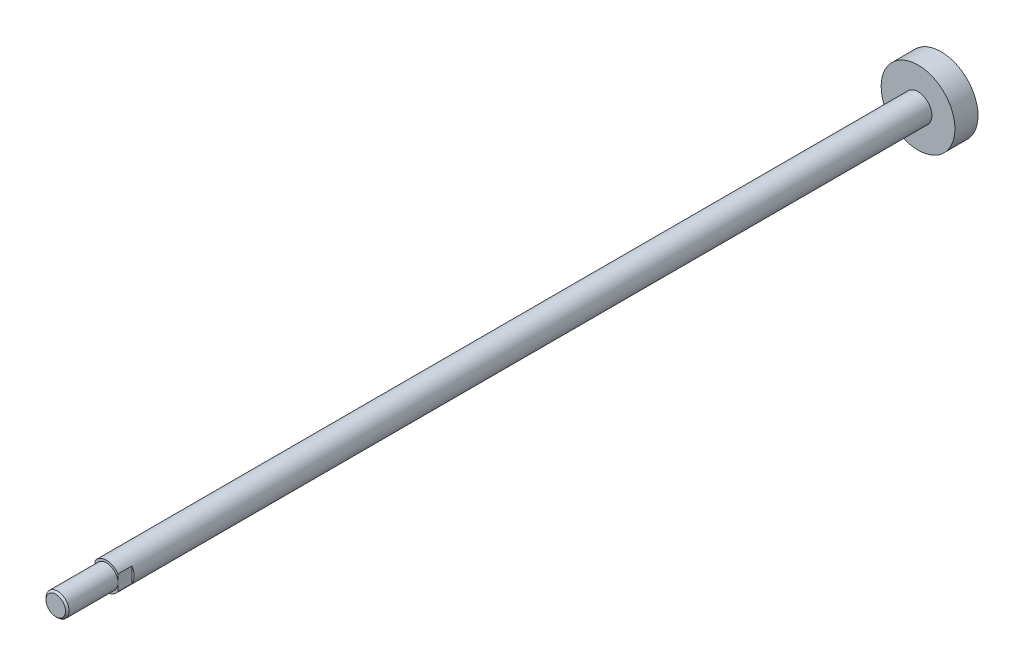
ISO-10303-21;
HEADER;
FILE_DESCRIPTION(('STEP AP214'),'2;1');
FILE_NAME('part.step','',(''),(''),'','','');
FILE_SCHEMA(('AUTOMOTIVE_DESIGN { 1 0 10303 214 1 1 1 1 }'));
ENDSEC;
DATA;
#1=APPLICATION_CONTEXT('core data for automotive mechanical design processes');
#2=APPLICATION_PROTOCOL_DEFINITION('international standard','automotive_design',2000,#1);
#3=PRODUCT_CONTEXT('',#1,'mechanical');
#4=PRODUCT('Part','Part','',(#3));
#5=PRODUCT_RELATED_PRODUCT_CATEGORY('part','',(#4));
#6=PRODUCT_DEFINITION_FORMATION('','',#4);
#7=PRODUCT_DEFINITION_CONTEXT('part definition',#1,'design');
#8=PRODUCT_DEFINITION('design','',#6,#7);
#9=PRODUCT_DEFINITION_SHAPE('','',#8);
#10=(LENGTH_UNIT() NAMED_UNIT(*) SI_UNIT(.MILLI.,.METRE.));
#11=(NAMED_UNIT(*) PLANE_ANGLE_UNIT() SI_UNIT($,.RADIAN.));
#12=(NAMED_UNIT(*) SI_UNIT($,.STERADIAN.) SOLID_ANGLE_UNIT());
#13=UNCERTAINTY_MEASURE_WITH_UNIT(LENGTH_MEASURE(1.E-05),#10,'distance_accuracy_value','');
#14=(GEOMETRIC_REPRESENTATION_CONTEXT(3) GLOBAL_UNCERTAINTY_ASSIGNED_CONTEXT((#13)) GLOBAL_UNIT_ASSIGNED_CONTEXT((#10,
#11,#12)) REPRESENTATION_CONTEXT('',''));
#15=CARTESIAN_POINT('',(0.,0.,0.));
#16=DIRECTION('',(0.,0.,1.));
#17=DIRECTION('',(1.,0.,0.));
#18=AXIS2_PLACEMENT_3D('',#15,#16,#17);
#19=CARTESIAN_POINT('',(5.,-6.02468583458361,25.));
#20=DIRECTION('',(0.,0.,1.));
#21=DIRECTION('',(0.,1.,0.));
#22=AXIS2_PLACEMENT_3D('',#19,#20,#21);
#23=PLANE('',#22);
#24=DIRECTION('',(0.,1.,0.));
#25=VECTOR('',#24,1.);
#26=CARTESIAN_POINT('',(5.,-3.31662479035539,25.));
#27=LINE('',#26,#25);
#28=CARTESIAN_POINT('',(5.,-3.31662479035539,25.));
#29=VERTEX_POINT('',#28);
#30=CARTESIAN_POINT('',(5.,0.,25.));
#31=VERTEX_POINT('',#30);
#32=EDGE_CURVE('E66',#29,#31,#27,.T.);
#33=ORIENTED_EDGE('',*,*,#32,.T.);
#34=CARTESIAN_POINT('',(0.,0.,25.));
#35=DIRECTION('',(0.,0.,-1.));
#36=DIRECTION('',(1.,0.,0.));
#37=AXIS2_PLACEMENT_3D('',#34,#35,#36);
#38=CIRCLE('',#37,5.);
#39=CARTESIAN_POINT('',(-5.,0.,25.));
#40=VERTEX_POINT('',#39);
#41=EDGE_CURVE('E80',#31,#40,#38,.T.);
#42=ORIENTED_EDGE('',*,*,#41,.T.);
#43=DIRECTION('',(0.,-1.,0.));
#44=VECTOR('',#43,1.);
#45=CARTESIAN_POINT('',(-5.,0.,25.));
#46=LINE('',#45,#44);
#47=CARTESIAN_POINT('',(-5.,-3.3166247903554,25.));
#48=VERTEX_POINT('',#47);
#49=EDGE_CURVE('E86',#40,#48,#46,.T.);
#50=ORIENTED_EDGE('',*,*,#49,.T.);
#51=CARTESIAN_POINT('',(0.,0.,25.));
#52=DIRECTION('',(0.,0.,1.));
#53=DIRECTION('',(-0.833333333333333,-0.552770798392567,0.));
#54=AXIS2_PLACEMENT_3D('',#51,#52,#53);
#55=CIRCLE('',#54,6.);
#56=EDGE_CURVE('E82',#29,#48,#55,.F.);
#57=ORIENTED_EDGE('',*,*,#56,.F.);
#58=EDGE_LOOP('',(#33,#42,#50,#57));
#59=FACE_BOUND('',#58,.T.);
#60=ADVANCED_FACE('F17',(#59),#23,.T.);
#61=CARTESIAN_POINT('',(5.,0.,25.));
#62=DIRECTION('',(0.,0.,1.));
#63=DIRECTION('',(0.,1.,0.));
#64=AXIS2_PLACEMENT_3D('',#61,#62,#63);
#65=PLANE('',#64);
#66=DIRECTION('',(0.,-1.,0.));
#67=VECTOR('',#66,1.);
#68=CARTESIAN_POINT('',(-5.,3.3166247903554,25.));
#69=LINE('',#68,#67);
#70=CARTESIAN_POINT('',(-5.,3.3166247903554,25.));
#71=VERTEX_POINT('',#70);
#72=EDGE_CURVE('E91',#71,#40,#69,.T.);
#73=ORIENTED_EDGE('',*,*,#72,.T.);
#74=CARTESIAN_POINT('',(0.,0.,25.));
#75=DIRECTION('',(0.,0.,-1.));
#76=DIRECTION('',(-1.,0.,0.));
#77=AXIS2_PLACEMENT_3D('',#74,#75,#76);
#78=CIRCLE('',#77,5.);
#79=EDGE_CURVE('E73',#40,#31,#78,.T.);
#80=ORIENTED_EDGE('',*,*,#79,.T.);
#81=DIRECTION('',(0.,1.,0.));
#82=VECTOR('',#81,1.);
#83=CARTESIAN_POINT('',(5.,0.,25.));
#84=LINE('',#83,#82);
#85=CARTESIAN_POINT('',(5.,3.3166247903554,25.));
#86=VERTEX_POINT('',#85);
#87=EDGE_CURVE('E62',#31,#86,#84,.T.);
#88=ORIENTED_EDGE('',*,*,#87,.T.);
#89=CARTESIAN_POINT('',(0.,0.,25.));
#90=DIRECTION('',(0.,0.,1.));
#91=DIRECTION('',(0.833333333333333,0.552770798392567,0.));
#92=AXIS2_PLACEMENT_3D('',#89,#90,#91);
#93=CIRCLE('',#92,6.);
#94=EDGE_CURVE('E72',#71,#86,#93,.F.);
#95=ORIENTED_EDGE('',*,*,#94,.F.);
#96=EDGE_LOOP('',(#73,#80,#88,#95));
#97=FACE_BOUND('',#96,.T.);
#98=ADVANCED_FACE('F89',(#97),#65,.T.);
#99=CARTESIAN_POINT('',(4.23300032542294,-4.23300000000003,47.));
#100=DIRECTION('',(0.,0.,1.));
#101=DIRECTION('',(0.,1.,0.));
#102=AXIS2_PLACEMENT_3D('',#99,#100,#101);
#103=PLANE('',#102);
#104=CARTESIAN_POINT('',(0.,0.,47.));
#105=DIRECTION('',(0.,0.,1.));
#106=DIRECTION('',(-1.,0.,0.));
#107=AXIS2_PLACEMENT_3D('',#104,#105,#106);
#108=CIRCLE('',#107,4.233);
#109=CARTESIAN_POINT('',(-4.233,0.,47.));
#110=VERTEX_POINT('',#109);
#111=EDGE_CURVE('E102',#110,#110,#108,.F.);
#112=ORIENTED_EDGE('',*,*,#111,.F.);
#113=EDGE_LOOP('',(#112));
#114=FACE_BOUND('',#113,.T.);
#115=ADVANCED_FACE('F180',(#114),#103,.T.);
#116=CARTESIAN_POINT('',(16.,-16.2972214998846,-327.));
#117=DIRECTION('',(0.,0.,1.));
#118=DIRECTION('',(0.,1.,0.));
#119=AXIS2_PLACEMENT_3D('',#116,#117,#118);
#120=PLANE('',#119);
#121=CARTESIAN_POINT('',(0.,0.,-327.));
#122=DIRECTION('',(0.,0.,1.));
#123=DIRECTION('',(-1.,0.,0.));
#124=AXIS2_PLACEMENT_3D('',#121,#122,#123);
#125=CIRCLE('',#124,16.);
#126=CARTESIAN_POINT('',(-16.,0.,-327.));
#127=VERTEX_POINT('',#126);
#128=EDGE_CURVE('E107',#127,#127,#125,.F.);
#129=ORIENTED_EDGE('',*,*,#128,.F.);
#130=EDGE_LOOP('',(#129));
#131=FACE_BOUND('',#130,.T.);
#132=CARTESIAN_POINT('',(0.,0.,-327.));
#133=DIRECTION('',(0.,0.,-1.));
#134=DIRECTION('',(1.,0.,0.));
#135=AXIS2_PLACEMENT_3D('',#132,#133,#134);
#136=CIRCLE('',#135,6.);
#137=CARTESIAN_POINT('',(6.,0.,-327.));
#138=VERTEX_POINT('',#137);
#139=EDGE_CURVE('E110',#138,#138,#136,.T.);
#140=ORIENTED_EDGE('',*,*,#139,.T.);
#141=EDGE_LOOP('',(#140));
#142=FACE_BOUND('',#141,.T.);
#143=ADVANCED_FACE('F172',(#131,#142),#120,.T.);
#144=CARTESIAN_POINT('',(-16.,-16.2972214998846,-337.));
#145=DIRECTION('',(0.,0.,-1.));
#146=DIRECTION('',(0.,1.,0.));
#147=AXIS2_PLACEMENT_3D('',#144,#145,#146);
#148=PLANE('',#147);
#149=CARTESIAN_POINT('',(0.,0.,-337.));
#150=DIRECTION('',(0.,0.,-1.));
#151=DIRECTION('',(1.,0.,0.));
#152=AXIS2_PLACEMENT_3D('',#149,#150,#151);
#153=CIRCLE('',#152,16.);
#154=CARTESIAN_POINT('',(16.,0.,-337.));
#155=VERTEX_POINT('',#154);
#156=EDGE_CURVE('E113',#155,#155,#153,.T.);
#157=ORIENTED_EDGE('',*,*,#156,.T.);
#158=EDGE_LOOP('',(#157));
#159=FACE_BOUND('',#158,.T.);
#160=ADVANCED_FACE('F163',(#159),#148,.T.);
#161=CARTESIAN_POINT('',(5.,-3.3166247903554,19.));
#162=DIRECTION('',(0.,0.,1.));
#163=DIRECTION('',(1.,0.,0.));
#164=AXIS2_PLACEMENT_3D('',#161,#162,#163);
#165=PLANE('',#164);
#166=CARTESIAN_POINT('',(0.,0.,19.));
#167=DIRECTION('',(0.,0.,1.));
#168=DIRECTION('',(1.,0.,0.));
#169=AXIS2_PLACEMENT_3D('',#166,#167,#168);
#170=CIRCLE('',#169,6.);
#171=CARTESIAN_POINT('',(5.,-3.3166247903554,19.));
#172=VERTEX_POINT('',#171);
#173=CARTESIAN_POINT('',(5.,3.3166247903554,19.));
#174=VERTEX_POINT('',#173);
#175=EDGE_CURVE('E116',#172,#174,#170,.T.);
#176=ORIENTED_EDGE('',*,*,#175,.T.);
#177=DIRECTION('',(0.,-1.,0.));
#178=VECTOR('',#177,1.);
#179=CARTESIAN_POINT('',(5.,3.3166247903554,19.));
#180=LINE('',#179,#178);
#181=EDGE_CURVE('E119',#172,#174,#180,.F.);
#182=ORIENTED_EDGE('',*,*,#181,.F.);
#183=EDGE_LOOP('',(#176,#182));
#184=FACE_BOUND('',#183,.T.);
#185=ADVANCED_FACE('F161',(#184),#165,.T.);
#186=CARTESIAN_POINT('',(5.,-3.3166247903554,25.));
#187=DIRECTION('',(1.,0.,0.));
#188=DIRECTION('',(0.,0.,-1.));
#189=AXIS2_PLACEMENT_3D('',#186,#187,#188);
#190=PLANE('',#189);
#191=ORIENTED_EDGE('',*,*,#32,.F.);
#192=DIRECTION('',(0.,0.,-1.));
#193=VECTOR('',#192,1.);
#194=CARTESIAN_POINT('',(5.,-3.31662479035539,25.));
#195=LINE('',#194,#193);
#196=EDGE_CURVE('E123',#172,#29,#195,.F.);
#197=ORIENTED_EDGE('',*,*,#196,.F.);
#198=ORIENTED_EDGE('',*,*,#181,.T.);
#199=DIRECTION('',(0.,0.,1.));
#200=VECTOR('',#199,1.);
#201=CARTESIAN_POINT('',(5.,3.3166247903554,19.));
#202=LINE('',#201,#200);
#203=EDGE_CURVE('E68',#174,#86,#202,.T.);
#204=ORIENTED_EDGE('',*,*,#203,.T.);
#205=ORIENTED_EDGE('',*,*,#87,.F.);
#206=EDGE_LOOP('',(#191,#197,#198,#204,#205));
#207=FACE_BOUND('',#206,.T.);
#208=ADVANCED_FACE('F64',(#207),#190,.T.);
#209=CARTESIAN_POINT('',(-6.,-3.3166247903554,19.));
#210=DIRECTION('',(0.,0.,1.));
#211=DIRECTION('',(1.,0.,0.));
#212=AXIS2_PLACEMENT_3D('',#209,#210,#211);
#213=PLANE('',#212);
#214=CARTESIAN_POINT('',(0.,0.,19.));
#215=DIRECTION('',(0.,0.,1.));
#216=DIRECTION('',(-1.,0.,0.));
#217=AXIS2_PLACEMENT_3D('',#214,#215,#216);
#218=CIRCLE('',#217,6.);
#219=CARTESIAN_POINT('',(-5.,3.3166247903554,19.));
#220=VERTEX_POINT('',#219);
#221=CARTESIAN_POINT('',(-5.,-3.3166247903554,19.));
#222=VERTEX_POINT('',#221);
#223=EDGE_CURVE('E32',#220,#222,#218,.T.);
#224=ORIENTED_EDGE('',*,*,#223,.T.);
#225=DIRECTION('',(0.,1.,0.));
#226=VECTOR('',#225,1.);
#227=CARTESIAN_POINT('',(-5.,-3.3166247903554,19.));
#228=LINE('',#227,#226);
#229=EDGE_CURVE('E133',#220,#222,#228,.F.);
#230=ORIENTED_EDGE('',*,*,#229,.F.);
#231=EDGE_LOOP('',(#224,#230));
#232=FACE_BOUND('',#231,.T.);
#233=ADVANCED_FACE('F170',(#232),#213,.T.);
#234=CARTESIAN_POINT('',(-5.,-3.3166247903554,19.));
#235=DIRECTION('',(-1.,0.,0.));
#236=DIRECTION('',(0.,0.,1.));
#237=AXIS2_PLACEMENT_3D('',#234,#235,#236);
#238=PLANE('',#237);
#239=ORIENTED_EDGE('',*,*,#72,.F.);
#240=DIRECTION('',(0.,0.,-1.));
#241=VECTOR('',#240,1.);
#242=CARTESIAN_POINT('',(-5.,3.3166247903554,25.));
#243=LINE('',#242,#241);
#244=EDGE_CURVE('E138',#220,#71,#243,.F.);
#245=ORIENTED_EDGE('',*,*,#244,.F.);
#246=ORIENTED_EDGE('',*,*,#229,.T.);
#247=DIRECTION('',(0.,0.,1.));
#248=VECTOR('',#247,1.);
#249=CARTESIAN_POINT('',(-5.,-3.3166247903554,19.));
#250=LINE('',#249,#248);
#251=EDGE_CURVE('E25',#222,#48,#250,.T.);
#252=ORIENTED_EDGE('',*,*,#251,.T.);
#253=ORIENTED_EDGE('',*,*,#49,.F.);
#254=EDGE_LOOP('',(#239,#245,#246,#252,#253));
#255=FACE_BOUND('',#254,.T.);
#256=ADVANCED_FACE('F146',(#255),#238,.T.);
#257=CARTESIAN_POINT('',(0.,0.,-337.));
#258=DIRECTION('',(0.,0.,-1.));
#259=DIRECTION('',(1.,0.,0.));
#260=AXIS2_PLACEMENT_3D('',#257,#258,#259);
#261=CYLINDRICAL_SURFACE('',#260,6.);
#262=ORIENTED_EDGE('',*,*,#139,.F.);
#263=EDGE_LOOP('',(#262));
#264=FACE_BOUND('',#263,.T.);
#265=ORIENTED_EDGE('',*,*,#196,.T.);
#266=ORIENTED_EDGE('',*,*,#56,.T.);
#267=ORIENTED_EDGE('',*,*,#251,.F.);
#268=ORIENTED_EDGE('',*,*,#223,.F.);
#269=ORIENTED_EDGE('',*,*,#244,.T.);
#270=ORIENTED_EDGE('',*,*,#94,.T.);
#271=ORIENTED_EDGE('',*,*,#203,.F.);
#272=ORIENTED_EDGE('',*,*,#175,.F.);
#273=EDGE_LOOP('',(#265,#266,#267,#268,#269,#270,#271,#272));
#274=FACE_BOUND('',#273,.T.);
#275=ADVANCED_FACE('F158',(#264,#274),#261,.T.);
#276=CARTESIAN_POINT('',(0.,0.,46.233));
#277=DIRECTION('',(0.,0.,-1.));
#278=DIRECTION('',(0.99999999999999,1.42250023438601E-07,0.));
#279=AXIS2_PLACEMENT_3D('',#276,#277,#278);
#280=CONICAL_SURFACE('',#279,5.00000000000002,0.785398163397473);
#281=CARTESIAN_POINT('',(0.,0.,46.233));
#282=DIRECTION('',(0.,0.,1.));
#283=DIRECTION('',(-1.,0.,0.));
#284=AXIS2_PLACEMENT_3D('',#281,#282,#283);
#285=CIRCLE('',#284,5.00000000000002);
#286=CARTESIAN_POINT('',(-5.00000000000002,0.,46.233));
#287=VERTEX_POINT('',#286);
#288=EDGE_CURVE('E11',#287,#287,#285,.F.);
#289=ORIENTED_EDGE('',*,*,#288,.F.);
#290=EDGE_LOOP('',(#289));
#291=FACE_BOUND('',#290,.T.);
#292=ORIENTED_EDGE('',*,*,#111,.T.);
#293=EDGE_LOOP('',(#292));
#294=FACE_BOUND('',#293,.T.);
#295=ADVANCED_FACE('F195',(#291,#294),#280,.T.);
#296=CARTESIAN_POINT('',(0.,0.,-337.));
#297=DIRECTION('',(0.,0.,-1.));
#298=DIRECTION('',(1.,0.,0.));
#299=AXIS2_PLACEMENT_3D('',#296,#297,#298);
#300=CYLINDRICAL_SURFACE('',#299,5.);
#301=ORIENTED_EDGE('',*,*,#288,.T.);
#302=EDGE_LOOP('',(#301));
#303=FACE_BOUND('',#302,.T.);
#304=ORIENTED_EDGE('',*,*,#41,.F.);
#305=ORIENTED_EDGE('',*,*,#79,.F.);
#306=EDGE_LOOP('',(#304,#305));
#307=FACE_BOUND('',#306,.T.);
#308=ADVANCED_FACE('F85',(#303,#307),#300,.T.);
#309=CARTESIAN_POINT('',(0.,0.,-337.));
#310=DIRECTION('',(0.,0.,-1.));
#311=DIRECTION('',(1.,0.,0.));
#312=AXIS2_PLACEMENT_3D('',#309,#310,#311);
#313=CYLINDRICAL_SURFACE('',#312,16.);
#314=ORIENTED_EDGE('',*,*,#156,.F.);
#315=EDGE_LOOP('',(#314));
#316=FACE_BOUND('',#315,.T.);
#317=ORIENTED_EDGE('',*,*,#128,.T.);
#318=EDGE_LOOP('',(#317));
#319=FACE_BOUND('',#318,.T.);
#320=ADVANCED_FACE('F19',(#316,#319),#313,.T.);
#321=CLOSED_SHELL('',(#60,#98,#115,#143,#160,#185,#208,#233,#256,#275,#295,#308,#320));
#322=MANIFOLD_SOLID_BREP('B1',#321);
#323=ADVANCED_BREP_SHAPE_REPRESENTATION('',(#18,#322),#14);
#324=SHAPE_DEFINITION_REPRESENTATION(#9,#323);
ENDSEC;
END-ISO-10303-21;
